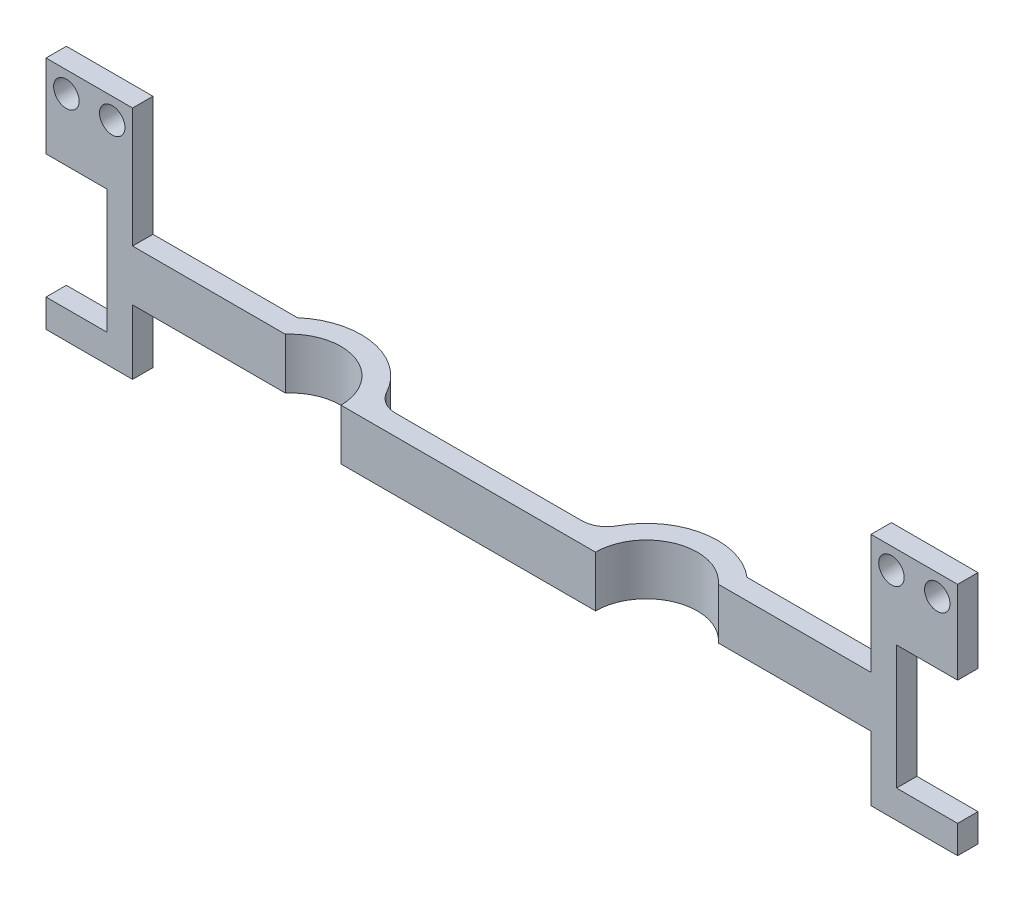
ISO-10303-21;
HEADER;
FILE_DESCRIPTION(('STEP AP214'),'2;1');
FILE_NAME('part.step','',(''),(''),'','','');
FILE_SCHEMA(('AUTOMOTIVE_DESIGN { 1 0 10303 214 1 1 1 1 }'));
ENDSEC;
DATA;
#1=APPLICATION_CONTEXT('core data for automotive mechanical design processes');
#2=APPLICATION_PROTOCOL_DEFINITION('international standard','automotive_design',2000,#1);
#3=PRODUCT_CONTEXT('',#1,'mechanical');
#4=PRODUCT('Part','Part','',(#3));
#5=PRODUCT_RELATED_PRODUCT_CATEGORY('part','',(#4));
#6=PRODUCT_DEFINITION_FORMATION('','',#4);
#7=PRODUCT_DEFINITION_CONTEXT('part definition',#1,'design');
#8=PRODUCT_DEFINITION('design','',#6,#7);
#9=PRODUCT_DEFINITION_SHAPE('','',#8);
#10=(LENGTH_UNIT() NAMED_UNIT(*) SI_UNIT(.MILLI.,.METRE.));
#11=(NAMED_UNIT(*) PLANE_ANGLE_UNIT() SI_UNIT($,.RADIAN.));
#12=(NAMED_UNIT(*) SI_UNIT($,.STERADIAN.) SOLID_ANGLE_UNIT());
#13=UNCERTAINTY_MEASURE_WITH_UNIT(LENGTH_MEASURE(1.E-05),#10,'distance_accuracy_value','');
#14=(GEOMETRIC_REPRESENTATION_CONTEXT(3) GLOBAL_UNCERTAINTY_ASSIGNED_CONTEXT((#13)) GLOBAL_UNIT_ASSIGNED_CONTEXT((#10,
#11,#12)) REPRESENTATION_CONTEXT('',''));
#15=CARTESIAN_POINT('',(0.,0.,0.));
#16=DIRECTION('',(0.,0.,1.));
#17=DIRECTION('',(1.,0.,0.));
#18=AXIS2_PLACEMENT_3D('',#15,#16,#17);
#19=CARTESIAN_POINT('',(-12.7,12.7,0.));
#20=DIRECTION('',(0.,-1.,0.));
#21=DIRECTION('',(0.,0.,-1.));
#22=AXIS2_PLACEMENT_3D('',#19,#20,#21);
#23=CYLINDRICAL_SURFACE('',#22,12.7);
#24=CARTESIAN_POINT('',(-12.7,0.,0.));
#25=DIRECTION('',(0.,-1.,0.));
#26=DIRECTION('',(0.,0.,-1.));
#27=AXIS2_PLACEMENT_3D('',#24,#25,#26);
#28=CIRCLE('',#27,12.7);
#29=CARTESIAN_POINT('',(-22.2410731052644,0.,-8.38200000000001));
#30=VERTEX_POINT('',#29);
#31=CARTESIAN_POINT('',(0.,0.,0.));
#32=VERTEX_POINT('',#31);
#33=EDGE_CURVE('E169',#30,#32,#28,.T.);
#34=ORIENTED_EDGE('',*,*,#33,.T.);
#35=DIRECTION('',(0.,-1.,0.));
#36=VECTOR('',#35,1.);
#37=CARTESIAN_POINT('',(0.,12.7,0.));
#38=LINE('',#37,#36);
#39=CARTESIAN_POINT('',(0.,12.7,0.));
#40=VERTEX_POINT('',#39);
#41=EDGE_CURVE('E11',#40,#32,#38,.T.);
#42=ORIENTED_EDGE('',*,*,#41,.F.);
#43=CARTESIAN_POINT('',(-12.7,12.7,0.));
#44=DIRECTION('',(0.,-1.,0.));
#45=DIRECTION('',(0.,0.,-1.));
#46=AXIS2_PLACEMENT_3D('',#43,#44,#45);
#47=CIRCLE('',#46,12.7);
#48=CARTESIAN_POINT('',(-22.2410731052644,12.7,-8.38200000000001));
#49=VERTEX_POINT('',#48);
#50=EDGE_CURVE('E214',#49,#40,#47,.T.);
#51=ORIENTED_EDGE('',*,*,#50,.F.);
#52=DIRECTION('',(0.,-1.,0.));
#53=VECTOR('',#52,1.);
#54=CARTESIAN_POINT('',(-22.2410731052644,12.7,-8.38200000000001));
#55=LINE('',#54,#53);
#56=EDGE_CURVE('E153',#49,#30,#55,.T.);
#57=ORIENTED_EDGE('',*,*,#56,.T.);
#58=EDGE_LOOP('',(#34,#42,#51,#57));
#59=FACE_BOUND('',#58,.T.);
#60=ADVANCED_FACE('F39',(#59),#23,.F.);
#61=CARTESIAN_POINT('',(0.,12.7,0.));
#62=DIRECTION('',(0.,0.,-1.));
#63=DIRECTION('',(-1.,0.,0.));
#64=AXIS2_PLACEMENT_3D('',#61,#62,#63);
#65=PLANE('',#64);
#66=DIRECTION('',(1.,0.,0.));
#67=VECTOR('',#66,1.);
#68=CARTESIAN_POINT('',(0.,0.,0.));
#69=LINE('',#68,#67);
#70=CARTESIAN_POINT('',(63.5,0.,0.));
#71=VERTEX_POINT('',#70);
#72=EDGE_CURVE('E173',#32,#71,#69,.T.);
#73=ORIENTED_EDGE('',*,*,#72,.T.);
#74=DIRECTION('',(0.,-1.,0.));
#75=VECTOR('',#74,1.);
#76=CARTESIAN_POINT('',(63.5,12.7,0.));
#77=LINE('',#76,#75);
#78=CARTESIAN_POINT('',(63.5,12.7,0.));
#79=VERTEX_POINT('',#78);
#80=EDGE_CURVE('E48',#79,#71,#77,.T.);
#81=ORIENTED_EDGE('',*,*,#80,.F.);
#82=DIRECTION('',(1.,0.,0.));
#83=VECTOR('',#82,1.);
#84=CARTESIAN_POINT('',(0.,12.7,0.));
#85=LINE('',#84,#83);
#86=EDGE_CURVE('E108',#40,#79,#85,.T.);
#87=ORIENTED_EDGE('',*,*,#86,.F.);
#88=ORIENTED_EDGE('',*,*,#41,.T.);
#89=EDGE_LOOP('',(#73,#81,#87,#88));
#90=FACE_BOUND('',#89,.T.);
#91=ADVANCED_FACE('F694',(#90),#65,.F.);
#92=CARTESIAN_POINT('',(76.2,12.7,0.));
#93=DIRECTION('',(0.,-1.,0.));
#94=DIRECTION('',(0.,0.,-1.));
#95=AXIS2_PLACEMENT_3D('',#92,#93,#94);
#96=CYLINDRICAL_SURFACE('',#95,12.7);
#97=CARTESIAN_POINT('',(76.2,0.,0.));
#98=DIRECTION('',(0.,-1.,0.));
#99=DIRECTION('',(0.,0.,1.));
#100=AXIS2_PLACEMENT_3D('',#97,#98,#99);
#101=CIRCLE('',#100,12.7);
#102=CARTESIAN_POINT('',(85.7410731052644,0.,-8.382));
#103=VERTEX_POINT('',#102);
#104=EDGE_CURVE('E177',#71,#103,#101,.T.);
#105=ORIENTED_EDGE('',*,*,#104,.T.);
#106=DIRECTION('',(0.,-1.,0.));
#107=VECTOR('',#106,1.);
#108=CARTESIAN_POINT('',(85.7410731052644,12.7,-8.382));
#109=LINE('',#108,#107);
#110=CARTESIAN_POINT('',(85.7410731052644,12.7,-8.382));
#111=VERTEX_POINT('',#110);
#112=EDGE_CURVE('E235',#111,#103,#109,.T.);
#113=ORIENTED_EDGE('',*,*,#112,.F.);
#114=CARTESIAN_POINT('',(76.2,12.7,0.));
#115=DIRECTION('',(0.,-1.,0.));
#116=DIRECTION('',(0.,0.,1.));
#117=AXIS2_PLACEMENT_3D('',#114,#115,#116);
#118=CIRCLE('',#117,12.7);
#119=EDGE_CURVE('E245',#79,#111,#118,.T.);
#120=ORIENTED_EDGE('',*,*,#119,.F.);
#121=ORIENTED_EDGE('',*,*,#80,.T.);
#122=EDGE_LOOP('',(#105,#113,#120,#121));
#123=FACE_BOUND('',#122,.T.);
#124=ADVANCED_FACE('F243',(#123),#96,.F.);
#125=CARTESIAN_POINT('',(123.841073105264,12.7,-8.38200000000001));
#126=DIRECTION('',(0.,0.,-1.));
#127=DIRECTION('',(-1.,0.,0.));
#128=AXIS2_PLACEMENT_3D('',#125,#126,#127);
#129=PLANE('',#128);
#130=CARTESIAN_POINT('',(140.351073105264,37.32276,-8.38200000000001));
#131=DIRECTION('',(0.,0.,-1.));
#132=DIRECTION('',(-1.,0.,0.));
#133=AXIS2_PLACEMENT_3D('',#130,#131,#132);
#134=CIRCLE('',#133,3.175);
#135=CARTESIAN_POINT('',(137.176073105264,37.32276,-8.38200000000001));
#136=VERTEX_POINT('',#135);
#137=EDGE_CURVE('E526',#136,#136,#134,.F.);
#138=ORIENTED_EDGE('',*,*,#137,.F.);
#139=EDGE_LOOP('',(#138));
#140=FACE_BOUND('',#139,.T.);
#141=CARTESIAN_POINT('',(128.921073105264,37.32276,-8.38200000000001));
#142=DIRECTION('',(0.,0.,-1.));
#143=DIRECTION('',(-1.,0.,0.));
#144=AXIS2_PLACEMENT_3D('',#141,#142,#143);
#145=CIRCLE('',#144,3.175);
#146=CARTESIAN_POINT('',(125.746073105264,37.32276,-8.38200000000001));
#147=VERTEX_POINT('',#146);
#148=EDGE_CURVE('E570',#147,#147,#145,.F.);
#149=ORIENTED_EDGE('',*,*,#148,.F.);
#150=EDGE_LOOP('',(#149));
#151=FACE_BOUND('',#150,.T.);
#152=DIRECTION('',(1.,0.,0.));
#153=VECTOR('',#152,1.);
#154=CARTESIAN_POINT('',(123.841073105264,0.,-8.38200000000001));
#155=LINE('',#154,#153);
#156=CARTESIAN_POINT('',(123.841073105264,0.,-8.38200000000001));
#157=VERTEX_POINT('',#156);
#158=EDGE_CURVE('E180',#103,#157,#155,.T.);
#159=ORIENTED_EDGE('',*,*,#158,.T.);
#160=DIRECTION('',(0.,-1.,0.));
#161=VECTOR('',#160,1.);
#162=CARTESIAN_POINT('',(123.841073105264,28.8036,-8.38200000000001));
#163=LINE('',#162,#161);
#164=CARTESIAN_POINT('',(123.841073105264,-16.1036,-8.38200000000001));
#165=VERTEX_POINT('',#164);
#166=EDGE_CURVE('E259',#157,#165,#163,.T.);
#167=ORIENTED_EDGE('',*,*,#166,.T.);
#168=DIRECTION('',(1.,0.,0.));
#169=VECTOR('',#168,1.);
#170=CARTESIAN_POINT('',(145.431073105264,-16.1036,-8.38200000000001));
#171=LINE('',#170,#169);
#172=CARTESIAN_POINT('',(145.431073105264,-16.1036,-8.38200000000001));
#173=VERTEX_POINT('',#172);
#174=EDGE_CURVE('E527',#165,#173,#171,.T.);
#175=ORIENTED_EDGE('',*,*,#174,.T.);
#176=DIRECTION('',(0.,1.,0.));
#177=VECTOR('',#176,1.);
#178=CARTESIAN_POINT('',(145.431073105264,-9.10590000000003,-8.38200000000001));
#179=LINE('',#178,#177);
#180=CARTESIAN_POINT('',(145.431073105264,-9.10590000000003,-8.38200000000001));
#181=VERTEX_POINT('',#180);
#182=EDGE_CURVE('E530',#173,#181,#179,.T.);
#183=ORIENTED_EDGE('',*,*,#182,.T.);
#184=DIRECTION('',(-1.,0.,0.));
#185=VECTOR('',#184,1.);
#186=CARTESIAN_POINT('',(130.191073105264,-9.10590000000002,-8.38200000000001));
#187=LINE('',#186,#185);
#188=CARTESIAN_POINT('',(130.191073105264,-9.10590000000002,-8.38200000000001));
#189=VERTEX_POINT('',#188);
#190=EDGE_CURVE('E534',#181,#189,#187,.T.);
#191=ORIENTED_EDGE('',*,*,#190,.T.);
#192=DIRECTION('',(0.,1.,0.));
#193=VECTOR('',#192,1.);
#194=CARTESIAN_POINT('',(130.191073105264,21.8059,-8.38200000000001));
#195=LINE('',#194,#193);
#196=CARTESIAN_POINT('',(130.191073105264,21.8059,-8.38200000000001));
#197=VERTEX_POINT('',#196);
#198=EDGE_CURVE('E538',#189,#197,#195,.T.);
#199=ORIENTED_EDGE('',*,*,#198,.T.);
#200=DIRECTION('',(1.,0.,0.));
#201=VECTOR('',#200,1.);
#202=CARTESIAN_POINT('',(145.431073105264,21.8059,-8.38200000000001));
#203=LINE('',#202,#201);
#204=CARTESIAN_POINT('',(145.431073105264,21.8059,-8.38200000000001));
#205=VERTEX_POINT('',#204);
#206=EDGE_CURVE('E542',#197,#205,#203,.T.);
#207=ORIENTED_EDGE('',*,*,#206,.T.);
#208=DIRECTION('',(0.,1.,0.));
#209=VECTOR('',#208,1.);
#210=CARTESIAN_POINT('',(145.431073105264,28.8036,-8.38200000000001));
#211=LINE('',#210,#209);
#212=CARTESIAN_POINT('',(145.431073105264,42.5196,-8.38200000000001));
#213=VERTEX_POINT('',#212);
#214=EDGE_CURVE('E546',#205,#213,#211,.T.);
#215=ORIENTED_EDGE('',*,*,#214,.T.);
#216=DIRECTION('',(-1.,0.,0.));
#217=VECTOR('',#216,1.);
#218=CARTESIAN_POINT('',(145.431073105264,42.5196,-8.38200000000001));
#219=LINE('',#218,#217);
#220=CARTESIAN_POINT('',(123.841073105264,42.5196,-8.38200000000001));
#221=VERTEX_POINT('',#220);
#222=EDGE_CURVE('E493',#213,#221,#219,.T.);
#223=ORIENTED_EDGE('',*,*,#222,.T.);
#224=CARTESIAN_POINT('',(123.841073105264,12.7,-8.38200000000001));
#225=VERTEX_POINT('',#224);
#226=EDGE_CURVE('E455',#221,#225,#163,.T.);
#227=ORIENTED_EDGE('',*,*,#226,.T.);
#228=DIRECTION('',(1.,0.,0.));
#229=VECTOR('',#228,1.);
#230=CARTESIAN_POINT('',(123.841073105264,12.7,-8.38200000000001));
#231=LINE('',#230,#229);
#232=EDGE_CURVE('E391',#111,#225,#231,.T.);
#233=ORIENTED_EDGE('',*,*,#232,.F.);
#234=ORIENTED_EDGE('',*,*,#112,.T.);
#235=EDGE_LOOP('',(#159,#167,#175,#183,#191,#199,#207,#215,#223,#227,#233,#234));
#236=FACE_BOUND('',#235,.T.);
#237=ADVANCED_FACE('F255',(#140,#151,#236),#129,.F.);
#238=CARTESIAN_POINT('',(123.841073105264,12.7,-13.462));
#239=DIRECTION('',(0.,0.,1.));
#240=DIRECTION('',(1.,0.,0.));
#241=AXIS2_PLACEMENT_3D('',#238,#239,#240);
#242=PLANE('',#241);
#243=CARTESIAN_POINT('',(140.351073105264,37.32276,-13.462));
#244=DIRECTION('',(0.,0.,-1.));
#245=DIRECTION('',(-1.,0.,0.));
#246=AXIS2_PLACEMENT_3D('',#243,#244,#245);
#247=CIRCLE('',#246,3.175);
#248=CARTESIAN_POINT('',(137.176073105264,37.32276,-13.462));
#249=VERTEX_POINT('',#248);
#250=EDGE_CURVE('E574',#249,#249,#247,.T.);
#251=ORIENTED_EDGE('',*,*,#250,.F.);
#252=EDGE_LOOP('',(#251));
#253=FACE_BOUND('',#252,.T.);
#254=CARTESIAN_POINT('',(128.921073105264,37.32276,-13.462));
#255=DIRECTION('',(0.,0.,-1.));
#256=DIRECTION('',(-1.,0.,0.));
#257=AXIS2_PLACEMENT_3D('',#254,#255,#256);
#258=CIRCLE('',#257,3.175);
#259=CARTESIAN_POINT('',(125.746073105264,37.32276,-13.462));
#260=VERTEX_POINT('',#259);
#261=EDGE_CURVE('E566',#260,#260,#258,.T.);
#262=ORIENTED_EDGE('',*,*,#261,.F.);
#263=EDGE_LOOP('',(#262));
#264=FACE_BOUND('',#263,.T.);
#265=DIRECTION('',(-1.,0.,0.));
#266=VECTOR('',#265,1.);
#267=CARTESIAN_POINT('',(123.841073105264,0.,-13.462));
#268=LINE('',#267,#266);
#269=CARTESIAN_POINT('',(123.841073105264,0.,-13.462));
#270=VERTEX_POINT('',#269);
#271=CARTESIAN_POINT('',(87.8147731790165,0.,-13.462));
#272=VERTEX_POINT('',#271);
#273=EDGE_CURVE('E188',#270,#272,#268,.T.);
#274=ORIENTED_EDGE('',*,*,#273,.T.);
#275=DIRECTION('',(0.,-1.,0.));
#276=VECTOR('',#275,1.);
#277=CARTESIAN_POINT('',(87.8147731790165,12.7,-13.462));
#278=LINE('',#277,#276);
#279=CARTESIAN_POINT('',(87.8147731790165,12.7,-13.462));
#280=VERTEX_POINT('',#279);
#281=EDGE_CURVE('E231',#280,#272,#278,.T.);
#282=ORIENTED_EDGE('',*,*,#281,.F.);
#283=DIRECTION('',(-1.,0.,0.));
#284=VECTOR('',#283,1.);
#285=CARTESIAN_POINT('',(123.841073105264,12.7,-13.462));
#286=LINE('',#285,#284);
#287=CARTESIAN_POINT('',(123.841073105264,12.7,-13.462));
#288=VERTEX_POINT('',#287);
#289=EDGE_CURVE('E399',#288,#280,#286,.T.);
#290=ORIENTED_EDGE('',*,*,#289,.F.);
#291=DIRECTION('',(0.,1.,0.));
#292=VECTOR('',#291,1.);
#293=CARTESIAN_POINT('',(123.841073105264,28.8036,-13.462));
#294=LINE('',#293,#292);
#295=CARTESIAN_POINT('',(123.841073105264,42.5196,-13.462));
#296=VERTEX_POINT('',#295);
#297=EDGE_CURVE('E521',#288,#296,#294,.T.);
#298=ORIENTED_EDGE('',*,*,#297,.T.);
#299=DIRECTION('',(1.,0.,0.));
#300=VECTOR('',#299,1.);
#301=CARTESIAN_POINT('',(145.431073105264,42.5196,-13.462));
#302=LINE('',#301,#300);
#303=CARTESIAN_POINT('',(145.431073105264,42.5196,-13.462));
#304=VERTEX_POINT('',#303);
#305=EDGE_CURVE('E513',#296,#304,#302,.T.);
#306=ORIENTED_EDGE('',*,*,#305,.T.);
#307=DIRECTION('',(0.,-1.,0.));
#308=VECTOR('',#307,1.);
#309=CARTESIAN_POINT('',(145.431073105264,28.8036,-13.462));
#310=LINE('',#309,#308);
#311=CARTESIAN_POINT('',(145.431073105264,21.8059,-13.462));
#312=VERTEX_POINT('',#311);
#313=EDGE_CURVE('E509',#304,#312,#310,.T.);
#314=ORIENTED_EDGE('',*,*,#313,.T.);
#315=DIRECTION('',(-1.,0.,0.));
#316=VECTOR('',#315,1.);
#317=CARTESIAN_POINT('',(145.431073105264,21.8059,-13.462));
#318=LINE('',#317,#316);
#319=CARTESIAN_POINT('',(130.191073105264,21.8059,-13.462));
#320=VERTEX_POINT('',#319);
#321=EDGE_CURVE('E505',#312,#320,#318,.T.);
#322=ORIENTED_EDGE('',*,*,#321,.T.);
#323=DIRECTION('',(0.,-1.,0.));
#324=VECTOR('',#323,1.);
#325=CARTESIAN_POINT('',(130.191073105264,21.8059,-13.462));
#326=LINE('',#325,#324);
#327=CARTESIAN_POINT('',(130.191073105264,-9.10590000000002,-13.462));
#328=VERTEX_POINT('',#327);
#329=EDGE_CURVE('E501',#320,#328,#326,.T.);
#330=ORIENTED_EDGE('',*,*,#329,.T.);
#331=DIRECTION('',(1.,0.,0.));
#332=VECTOR('',#331,1.);
#333=CARTESIAN_POINT('',(130.191073105264,-9.10590000000002,-13.462));
#334=LINE('',#333,#332);
#335=CARTESIAN_POINT('',(145.431073105264,-9.10590000000003,-13.462));
#336=VERTEX_POINT('',#335);
#337=EDGE_CURVE('E497',#328,#336,#334,.T.);
#338=ORIENTED_EDGE('',*,*,#337,.T.);
#339=DIRECTION('',(0.,-1.,0.));
#340=VECTOR('',#339,1.);
#341=CARTESIAN_POINT('',(145.431073105264,-9.10590000000003,-13.462));
#342=LINE('',#341,#340);
#343=CARTESIAN_POINT('',(145.431073105264,-16.1036,-13.462));
#344=VERTEX_POINT('',#343);
#345=EDGE_CURVE('E465',#336,#344,#342,.T.);
#346=ORIENTED_EDGE('',*,*,#345,.T.);
#347=DIRECTION('',(-1.,0.,0.));
#348=VECTOR('',#347,1.);
#349=CARTESIAN_POINT('',(145.431073105264,-16.1036,-13.462));
#350=LINE('',#349,#348);
#351=CARTESIAN_POINT('',(123.841073105264,-16.1036,-13.462));
#352=VERTEX_POINT('',#351);
#353=EDGE_CURVE('E522',#344,#352,#350,.T.);
#354=ORIENTED_EDGE('',*,*,#353,.T.);
#355=EDGE_CURVE('E517',#352,#270,#294,.T.);
#356=ORIENTED_EDGE('',*,*,#355,.T.);
#357=EDGE_LOOP('',(#274,#282,#290,#298,#306,#314,#322,#330,#338,#346,#354,#356));
#358=FACE_BOUND('',#357,.T.);
#359=ADVANCED_FACE('F587',(#253,#264,#358),#242,.F.);
#360=CARTESIAN_POINT('',(76.2,12.7,0.));
#361=DIRECTION('',(0.,-1.,0.));
#362=DIRECTION('',(0.,0.,-1.));
#363=AXIS2_PLACEMENT_3D('',#360,#361,#362);
#364=CYLINDRICAL_SURFACE('',#363,17.78);
#365=CARTESIAN_POINT('',(76.2,0.,0.));
#366=DIRECTION('',(0.,1.,0.));
#367=DIRECTION('',(0.,0.,1.));
#368=AXIS2_PLACEMENT_3D('',#365,#366,#367);
#369=CIRCLE('',#368,17.78);
#370=CARTESIAN_POINT('',(60.5412470823412,0.,-8.4221052631579));
#371=VERTEX_POINT('',#370);
#372=EDGE_CURVE('E191',#272,#371,#369,.T.);
#373=ORIENTED_EDGE('',*,*,#372,.T.);
#374=DIRECTION('',(0.,-1.,0.));
#375=VECTOR('',#374,1.);
#376=CARTESIAN_POINT('',(60.5412470823412,12.7,-8.4221052631579));
#377=LINE('',#376,#375);
#378=CARTESIAN_POINT('',(60.5412470823412,12.7,-8.4221052631579));
#379=VERTEX_POINT('',#378);
#380=EDGE_CURVE('E227',#379,#371,#377,.T.);
#381=ORIENTED_EDGE('',*,*,#380,.F.);
#382=CARTESIAN_POINT('',(76.2,12.7,0.));
#383=DIRECTION('',(0.,1.,0.));
#384=DIRECTION('',(0.,0.,1.));
#385=AXIS2_PLACEMENT_3D('',#382,#383,#384);
#386=CIRCLE('',#385,17.78);
#387=EDGE_CURVE('E402',#280,#379,#386,.T.);
#388=ORIENTED_EDGE('',*,*,#387,.F.);
#389=ORIENTED_EDGE('',*,*,#281,.T.);
#390=EDGE_LOOP('',(#373,#381,#388,#389));
#391=FACE_BOUND('',#390,.T.);
#392=ADVANCED_FACE('F590',(#391),#364,.T.);
#393=CARTESIAN_POINT('',(54.9488353260345,12.7,-11.43));
#394=DIRECTION('',(0.,-1.,0.));
#395=DIRECTION('',(0.,0.,-1.));
#396=AXIS2_PLACEMENT_3D('',#393,#394,#395);
#397=CYLINDRICAL_SURFACE('',#396,6.35);
#398=CARTESIAN_POINT('',(54.9488353260345,0.,-11.43));
#399=DIRECTION('',(0.,-1.,0.));
#400=DIRECTION('',(0.,0.,1.));
#401=AXIS2_PLACEMENT_3D('',#398,#399,#400);
#402=CIRCLE('',#401,6.35);
#403=CARTESIAN_POINT('',(54.9488353260345,0.,-5.08));
#404=VERTEX_POINT('',#403);
#405=EDGE_CURVE('E194',#371,#404,#402,.T.);
#406=ORIENTED_EDGE('',*,*,#405,.T.);
#407=DIRECTION('',(0.,-1.,0.));
#408=VECTOR('',#407,1.);
#409=CARTESIAN_POINT('',(54.9488353260345,12.7,-5.08));
#410=LINE('',#409,#408);
#411=CARTESIAN_POINT('',(54.9488353260345,12.7,-5.08));
#412=VERTEX_POINT('',#411);
#413=EDGE_CURVE('E223',#412,#404,#410,.T.);
#414=ORIENTED_EDGE('',*,*,#413,.F.);
#415=CARTESIAN_POINT('',(54.9488353260345,12.7,-11.43));
#416=DIRECTION('',(0.,-1.,0.));
#417=DIRECTION('',(0.,0.,1.));
#418=AXIS2_PLACEMENT_3D('',#415,#416,#417);
#419=CIRCLE('',#418,6.35);
#420=EDGE_CURVE('E405',#379,#412,#419,.T.);
#421=ORIENTED_EDGE('',*,*,#420,.F.);
#422=ORIENTED_EDGE('',*,*,#380,.T.);
#423=EDGE_LOOP('',(#406,#414,#421,#422));
#424=FACE_BOUND('',#423,.T.);
#425=ADVANCED_FACE('F606',(#424),#397,.F.);
#426=CARTESIAN_POINT('',(8.55116467396553,12.7,-5.08));
#427=DIRECTION('',(0.,0.,1.));
#428=DIRECTION('',(1.,0.,0.));
#429=AXIS2_PLACEMENT_3D('',#426,#427,#428);
#430=PLANE('',#429);
#431=DIRECTION('',(-1.,0.,0.));
#432=VECTOR('',#431,1.);
#433=CARTESIAN_POINT('',(8.55116467396553,0.,-5.08));
#434=LINE('',#433,#432);
#435=CARTESIAN_POINT('',(8.55116467396553,0.,-5.08));
#436=VERTEX_POINT('',#435);
#437=EDGE_CURVE('E197',#404,#436,#434,.T.);
#438=ORIENTED_EDGE('',*,*,#437,.T.);
#439=DIRECTION('',(0.,-1.,0.));
#440=VECTOR('',#439,1.);
#441=CARTESIAN_POINT('',(8.55116467396553,12.7,-5.08));
#442=LINE('',#441,#440);
#443=CARTESIAN_POINT('',(8.55116467396553,12.7,-5.08));
#444=VERTEX_POINT('',#443);
#445=EDGE_CURVE('E219',#444,#436,#442,.T.);
#446=ORIENTED_EDGE('',*,*,#445,.F.);
#447=DIRECTION('',(-1.,0.,0.));
#448=VECTOR('',#447,1.);
#449=CARTESIAN_POINT('',(8.55116467396553,12.7,-5.08));
#450=LINE('',#449,#448);
#451=EDGE_CURVE('E408',#412,#444,#450,.T.);
#452=ORIENTED_EDGE('',*,*,#451,.F.);
#453=ORIENTED_EDGE('',*,*,#413,.T.);
#454=EDGE_LOOP('',(#438,#446,#452,#453));
#455=FACE_BOUND('',#454,.T.);
#456=ADVANCED_FACE('F610',(#455),#430,.F.);
#457=CARTESIAN_POINT('',(8.55116467396553,12.7,-11.43));
#458=DIRECTION('',(0.,-1.,0.));
#459=DIRECTION('',(0.,0.,-1.));
#460=AXIS2_PLACEMENT_3D('',#457,#458,#459);
#461=CYLINDRICAL_SURFACE('',#460,6.35000000000001);
#462=CARTESIAN_POINT('',(8.55116467396553,0.,-11.43));
#463=DIRECTION('',(0.,-1.,0.));
#464=DIRECTION('',(0.,0.,-1.));
#465=AXIS2_PLACEMENT_3D('',#462,#463,#464);
#466=CIRCLE('',#465,6.35000000000001);
#467=CARTESIAN_POINT('',(2.95875291765881,0.,-8.4221052631579));
#468=VERTEX_POINT('',#467);
#469=EDGE_CURVE('E200',#436,#468,#466,.T.);
#470=ORIENTED_EDGE('',*,*,#469,.T.);
#471=DIRECTION('',(0.,-1.,0.));
#472=VECTOR('',#471,1.);
#473=CARTESIAN_POINT('',(2.95875291765881,12.7,-8.4221052631579));
#474=LINE('',#473,#472);
#475=CARTESIAN_POINT('',(2.95875291765881,12.7,-8.4221052631579));
#476=VERTEX_POINT('',#475);
#477=EDGE_CURVE('E152',#476,#468,#474,.T.);
#478=ORIENTED_EDGE('',*,*,#477,.F.);
#479=CARTESIAN_POINT('',(8.55116467396553,12.7,-11.43));
#480=DIRECTION('',(0.,-1.,0.));
#481=DIRECTION('',(0.,0.,-1.));
#482=AXIS2_PLACEMENT_3D('',#479,#480,#481);
#483=CIRCLE('',#482,6.35000000000001);
#484=EDGE_CURVE('E142',#444,#476,#483,.T.);
#485=ORIENTED_EDGE('',*,*,#484,.F.);
#486=ORIENTED_EDGE('',*,*,#445,.T.);
#487=EDGE_LOOP('',(#470,#478,#485,#486));
#488=FACE_BOUND('',#487,.T.);
#489=ADVANCED_FACE('F712',(#488),#461,.F.);
#490=CARTESIAN_POINT('',(-12.7,12.7,0.));
#491=DIRECTION('',(0.,-1.,0.));
#492=DIRECTION('',(0.,0.,-1.));
#493=AXIS2_PLACEMENT_3D('',#490,#491,#492);
#494=CYLINDRICAL_SURFACE('',#493,17.78);
#495=CARTESIAN_POINT('',(-12.7,0.,0.));
#496=DIRECTION('',(0.,1.,0.));
#497=DIRECTION('',(0.,0.,-1.));
#498=AXIS2_PLACEMENT_3D('',#495,#496,#497);
#499=CIRCLE('',#498,17.78);
#500=CARTESIAN_POINT('',(-24.3147731790165,0.,-13.462));
#501=VERTEX_POINT('',#500);
#502=EDGE_CURVE('E93',#468,#501,#499,.T.);
#503=ORIENTED_EDGE('',*,*,#502,.T.);
#504=DIRECTION('',(0.,-1.,0.));
#505=VECTOR('',#504,1.);
#506=CARTESIAN_POINT('',(-24.3147731790165,12.7,-13.462));
#507=LINE('',#506,#505);
#508=CARTESIAN_POINT('',(-24.3147731790165,12.7,-13.462));
#509=VERTEX_POINT('',#508);
#510=EDGE_CURVE('E146',#509,#501,#507,.T.);
#511=ORIENTED_EDGE('',*,*,#510,.F.);
#512=CARTESIAN_POINT('',(-12.7,12.7,0.));
#513=DIRECTION('',(0.,1.,0.));
#514=DIRECTION('',(0.,0.,-1.));
#515=AXIS2_PLACEMENT_3D('',#512,#513,#514);
#516=CIRCLE('',#515,17.78);
#517=EDGE_CURVE('E136',#476,#509,#516,.T.);
#518=ORIENTED_EDGE('',*,*,#517,.F.);
#519=ORIENTED_EDGE('',*,*,#477,.T.);
#520=EDGE_LOOP('',(#503,#511,#518,#519));
#521=FACE_BOUND('',#520,.T.);
#522=ADVANCED_FACE('F147',(#521),#494,.T.);
#523=CARTESIAN_POINT('',(-60.3410731052644,12.7,-13.462));
#524=DIRECTION('',(0.,0.,1.));
#525=DIRECTION('',(1.,0.,0.));
#526=AXIS2_PLACEMENT_3D('',#523,#524,#525);
#527=PLANE('',#526);
#528=CARTESIAN_POINT('',(-65.4210731052644,37.32276,-13.462));
#529=DIRECTION('',(0.,0.,-1.));
#530=DIRECTION('',(-1.,0.,0.));
#531=AXIS2_PLACEMENT_3D('',#528,#529,#530);
#532=CIRCLE('',#531,3.175);
#533=CARTESIAN_POINT('',(-68.5960731052644,37.32276,-13.462));
#534=VERTEX_POINT('',#533);
#535=EDGE_CURVE('E557',#534,#534,#532,.T.);
#536=ORIENTED_EDGE('',*,*,#535,.F.);
#537=EDGE_LOOP('',(#536));
#538=FACE_BOUND('',#537,.T.);
#539=CARTESIAN_POINT('',(-76.8510731052644,37.32276,-13.4619999999999));
#540=DIRECTION('',(0.,0.,-1.));
#541=DIRECTION('',(-1.,0.,0.));
#542=AXIS2_PLACEMENT_3D('',#539,#540,#541);
#543=CIRCLE('',#542,3.175);
#544=CARTESIAN_POINT('',(-80.0260731052644,37.32276,-13.4619999999999));
#545=VERTEX_POINT('',#544);
#546=EDGE_CURVE('E558',#545,#545,#543,.T.);
#547=ORIENTED_EDGE('',*,*,#546,.F.);
#548=EDGE_LOOP('',(#547));
#549=FACE_BOUND('',#548,.T.);
#550=DIRECTION('',(-1.,0.,0.));
#551=VECTOR('',#550,1.);
#552=CARTESIAN_POINT('',(-60.3410731052644,0.,-13.462));
#553=LINE('',#552,#551);
#554=CARTESIAN_POINT('',(-60.3410731052644,0.,-13.462));
#555=VERTEX_POINT('',#554);
#556=EDGE_CURVE('E205',#501,#555,#553,.T.);
#557=ORIENTED_EDGE('',*,*,#556,.T.);
#558=DIRECTION('',(0.,-1.,0.));
#559=VECTOR('',#558,1.);
#560=CARTESIAN_POINT('',(-60.3410731052644,-16.1036,-13.462));
#561=LINE('',#560,#559);
#562=CARTESIAN_POINT('',(-60.3410731052644,-16.1036,-13.462));
#563=VERTEX_POINT('',#562);
#564=EDGE_CURVE('E327',#555,#563,#561,.T.);
#565=ORIENTED_EDGE('',*,*,#564,.T.);
#566=DIRECTION('',(-1.,0.,0.));
#567=VECTOR('',#566,1.);
#568=CARTESIAN_POINT('',(-81.9310731052644,-16.1036,-13.462));
#569=LINE('',#568,#567);
#570=CARTESIAN_POINT('',(-81.9310731052644,-16.1036,-13.462));
#571=VERTEX_POINT('',#570);
#572=EDGE_CURVE('E381',#563,#571,#569,.T.);
#573=ORIENTED_EDGE('',*,*,#572,.T.);
#574=DIRECTION('',(0.,1.,0.));
#575=VECTOR('',#574,1.);
#576=CARTESIAN_POINT('',(-81.9310731052644,-9.1059,-13.462));
#577=LINE('',#576,#575);
#578=CARTESIAN_POINT('',(-81.9310731052644,-9.1059,-13.462));
#579=VERTEX_POINT('',#578);
#580=EDGE_CURVE('E452',#571,#579,#577,.T.);
#581=ORIENTED_EDGE('',*,*,#580,.T.);
#582=DIRECTION('',(1.,0.,0.));
#583=VECTOR('',#582,1.);
#584=CARTESIAN_POINT('',(-66.6910731052644,-9.1059,-13.462));
#585=LINE('',#584,#583);
#586=CARTESIAN_POINT('',(-66.6910731052644,-9.1059,-13.462));
#587=VERTEX_POINT('',#586);
#588=EDGE_CURVE('E448',#579,#587,#585,.T.);
#589=ORIENTED_EDGE('',*,*,#588,.T.);
#590=DIRECTION('',(0.,1.,0.));
#591=VECTOR('',#590,1.);
#592=CARTESIAN_POINT('',(-66.6910731052644,21.8059,-13.462));
#593=LINE('',#592,#591);
#594=CARTESIAN_POINT('',(-66.6910731052644,21.8059,-13.462));
#595=VERTEX_POINT('',#594);
#596=EDGE_CURVE('E444',#587,#595,#593,.T.);
#597=ORIENTED_EDGE('',*,*,#596,.T.);
#598=DIRECTION('',(-1.,0.,0.));
#599=VECTOR('',#598,1.);
#600=CARTESIAN_POINT('',(-81.9310731052644,21.8059,-13.462));
#601=LINE('',#600,#599);
#602=CARTESIAN_POINT('',(-81.9310731052644,21.8059,-13.462));
#603=VERTEX_POINT('',#602);
#604=EDGE_CURVE('E440',#595,#603,#601,.T.);
#605=ORIENTED_EDGE('',*,*,#604,.T.);
#606=DIRECTION('',(0.,1.,0.));
#607=VECTOR('',#606,1.);
#608=CARTESIAN_POINT('',(-81.9310731052644,28.8036,-13.462));
#609=LINE('',#608,#607);
#610=CARTESIAN_POINT('',(-81.9310731052644,42.5196,-13.462));
#611=VERTEX_POINT('',#610);
#612=EDGE_CURVE('E436',#603,#611,#609,.T.);
#613=ORIENTED_EDGE('',*,*,#612,.T.);
#614=DIRECTION('',(1.,0.,0.));
#615=VECTOR('',#614,1.);
#616=CARTESIAN_POINT('',(-60.3410731052644,42.5196,-13.462));
#617=LINE('',#616,#615);
#618=CARTESIAN_POINT('',(-60.3410731052644,42.5196,-13.462));
#619=VERTEX_POINT('',#618);
#620=EDGE_CURVE('E336',#611,#619,#617,.T.);
#621=ORIENTED_EDGE('',*,*,#620,.T.);
#622=CARTESIAN_POINT('',(-60.3410731052644,12.7,-13.462));
#623=VERTEX_POINT('',#622);
#624=EDGE_CURVE('E159',#619,#623,#561,.T.);
#625=ORIENTED_EDGE('',*,*,#624,.T.);
#626=DIRECTION('',(-1.,0.,0.));
#627=VECTOR('',#626,1.);
#628=CARTESIAN_POINT('',(-60.3410731052644,12.7,-13.462));
#629=LINE('',#628,#627);
#630=EDGE_CURVE('E140',#509,#623,#629,.T.);
#631=ORIENTED_EDGE('',*,*,#630,.F.);
#632=ORIENTED_EDGE('',*,*,#510,.T.);
#633=EDGE_LOOP('',(#557,#565,#573,#581,#589,#597,#605,#613,#621,#625,#631,#632));
#634=FACE_BOUND('',#633,.T.);
#635=ADVANCED_FACE('F156',(#538,#549,#634),#527,.F.);
#636=CARTESIAN_POINT('',(-60.3410731052644,12.7,-8.38200000000001));
#637=DIRECTION('',(0.,0.,-1.));
#638=DIRECTION('',(-1.,0.,0.));
#639=AXIS2_PLACEMENT_3D('',#636,#637,#638);
#640=PLANE('',#639);
#641=CARTESIAN_POINT('',(-65.4210731052644,37.32276,-8.38199999999998));
#642=DIRECTION('',(0.,0.,-1.));
#643=DIRECTION('',(-1.,0.,0.));
#644=AXIS2_PLACEMENT_3D('',#641,#642,#643);
#645=CIRCLE('',#644,3.175);
#646=CARTESIAN_POINT('',(-68.5960731052644,37.32276,-8.38199999999998));
#647=VERTEX_POINT('',#646);
#648=EDGE_CURVE('E562',#647,#647,#645,.F.);
#649=ORIENTED_EDGE('',*,*,#648,.F.);
#650=EDGE_LOOP('',(#649));
#651=FACE_BOUND('',#650,.T.);
#652=CARTESIAN_POINT('',(-76.8510731052644,37.32276,-8.38199999999998));
#653=DIRECTION('',(0.,0.,-1.));
#654=DIRECTION('',(-1.,0.,0.));
#655=AXIS2_PLACEMENT_3D('',#652,#653,#654);
#656=CIRCLE('',#655,3.175);
#657=CARTESIAN_POINT('',(-80.0260731052644,37.32276,-8.38199999999998));
#658=VERTEX_POINT('',#657);
#659=EDGE_CURVE('E553',#658,#658,#656,.F.);
#660=ORIENTED_EDGE('',*,*,#659,.F.);
#661=EDGE_LOOP('',(#660));
#662=FACE_BOUND('',#661,.T.);
#663=DIRECTION('',(1.,0.,0.));
#664=VECTOR('',#663,1.);
#665=CARTESIAN_POINT('',(-60.3410731052644,0.,-8.38200000000001));
#666=LINE('',#665,#664);
#667=CARTESIAN_POINT('',(-60.3410731052644,0.,-8.38200000000001));
#668=VERTEX_POINT('',#667);
#669=EDGE_CURVE('E100',#668,#30,#666,.T.);
#670=ORIENTED_EDGE('',*,*,#669,.T.);
#671=ORIENTED_EDGE('',*,*,#56,.F.);
#672=DIRECTION('',(1.,0.,0.));
#673=VECTOR('',#672,1.);
#674=CARTESIAN_POINT('',(-60.3410731052644,12.7,-8.38200000000001));
#675=LINE('',#674,#673);
#676=CARTESIAN_POINT('',(-60.3410731052644,12.7,-8.38200000000001));
#677=VERTEX_POINT('',#676);
#678=EDGE_CURVE('E56',#677,#49,#675,.T.);
#679=ORIENTED_EDGE('',*,*,#678,.F.);
#680=DIRECTION('',(0.,1.,0.));
#681=VECTOR('',#680,1.);
#682=CARTESIAN_POINT('',(-60.3410731052644,-16.1036,-8.38200000000001));
#683=LINE('',#682,#681);
#684=CARTESIAN_POINT('',(-60.3410731052644,42.5196,-8.38200000000001));
#685=VERTEX_POINT('',#684);
#686=EDGE_CURVE('E342',#677,#685,#683,.T.);
#687=ORIENTED_EDGE('',*,*,#686,.T.);
#688=DIRECTION('',(-1.,0.,0.));
#689=VECTOR('',#688,1.);
#690=CARTESIAN_POINT('',(-60.3410731052644,42.5196,-8.38200000000001));
#691=LINE('',#690,#689);
#692=CARTESIAN_POINT('',(-81.9310731052644,42.5196,-8.38200000000001));
#693=VERTEX_POINT('',#692);
#694=EDGE_CURVE('E344',#685,#693,#691,.T.);
#695=ORIENTED_EDGE('',*,*,#694,.T.);
#696=DIRECTION('',(0.,-1.,0.));
#697=VECTOR('',#696,1.);
#698=CARTESIAN_POINT('',(-81.9310731052644,28.8036,-8.38200000000001));
#699=LINE('',#698,#697);
#700=CARTESIAN_POINT('',(-81.9310731052644,21.8059,-8.38200000000001));
#701=VERTEX_POINT('',#700);
#702=EDGE_CURVE('E357',#693,#701,#699,.T.);
#703=ORIENTED_EDGE('',*,*,#702,.T.);
#704=DIRECTION('',(1.,0.,0.));
#705=VECTOR('',#704,1.);
#706=CARTESIAN_POINT('',(-81.9310731052644,21.8059,-8.38200000000001));
#707=LINE('',#706,#705);
#708=CARTESIAN_POINT('',(-66.6910731052644,21.8059,-8.38200000000001));
#709=VERTEX_POINT('',#708);
#710=EDGE_CURVE('E419',#701,#709,#707,.T.);
#711=ORIENTED_EDGE('',*,*,#710,.T.);
#712=DIRECTION('',(0.,-1.,0.));
#713=VECTOR('',#712,1.);
#714=CARTESIAN_POINT('',(-66.6910731052644,21.8059,-8.38200000000001));
#715=LINE('',#714,#713);
#716=CARTESIAN_POINT('',(-66.6910731052644,-9.1059,-8.38200000000001));
#717=VERTEX_POINT('',#716);
#718=EDGE_CURVE('E422',#709,#717,#715,.T.);
#719=ORIENTED_EDGE('',*,*,#718,.T.);
#720=DIRECTION('',(-1.,0.,0.));
#721=VECTOR('',#720,1.);
#722=CARTESIAN_POINT('',(-66.6910731052644,-9.1059,-8.38200000000001));
#723=LINE('',#722,#721);
#724=CARTESIAN_POINT('',(-81.9310731052644,-9.1059,-8.38200000000001));
#725=VERTEX_POINT('',#724);
#726=EDGE_CURVE('E174',#717,#725,#723,.T.);
#727=ORIENTED_EDGE('',*,*,#726,.T.);
#728=DIRECTION('',(0.,-1.,0.));
#729=VECTOR('',#728,1.);
#730=CARTESIAN_POINT('',(-81.9310731052644,-9.1059,-8.38200000000001));
#731=LINE('',#730,#729);
#732=CARTESIAN_POINT('',(-81.9310731052644,-16.1036,-8.38200000000001));
#733=VERTEX_POINT('',#732);
#734=EDGE_CURVE('E384',#725,#733,#731,.T.);
#735=ORIENTED_EDGE('',*,*,#734,.T.);
#736=DIRECTION('',(1.,0.,0.));
#737=VECTOR('',#736,1.);
#738=CARTESIAN_POINT('',(-81.9310731052644,-16.1036,-8.38200000000001));
#739=LINE('',#738,#737);
#740=CARTESIAN_POINT('',(-60.3410731052644,-16.1036,-8.38200000000001));
#741=VERTEX_POINT('',#740);
#742=EDGE_CURVE('E413',#733,#741,#739,.T.);
#743=ORIENTED_EDGE('',*,*,#742,.T.);
#744=EDGE_CURVE('E348',#741,#668,#683,.T.);
#745=ORIENTED_EDGE('',*,*,#744,.T.);
#746=EDGE_LOOP('',(#670,#671,#679,#687,#695,#703,#711,#719,#727,#735,#743,#745));
#747=FACE_BOUND('',#746,.T.);
#748=ADVANCED_FACE('F341',(#651,#662,#747),#640,.F.);
#749=CARTESIAN_POINT('',(-12.7,12.7,0.));
#750=DIRECTION('',(0.,-1.,0.));
#751=DIRECTION('',(0.,0.,-1.));
#752=AXIS2_PLACEMENT_3D('',#749,#750,#751);
#753=PLANE('',#752);
#754=ORIENTED_EDGE('',*,*,#50,.T.);
#755=ORIENTED_EDGE('',*,*,#86,.T.);
#756=ORIENTED_EDGE('',*,*,#119,.T.);
#757=ORIENTED_EDGE('',*,*,#232,.T.);
#758=DIRECTION('',(0.,0.,-1.));
#759=VECTOR('',#758,1.);
#760=CARTESIAN_POINT('',(123.841073105264,12.7,-13.462));
#761=LINE('',#760,#759);
#762=EDGE_CURVE('E395',#225,#288,#761,.T.);
#763=ORIENTED_EDGE('',*,*,#762,.T.);
#764=ORIENTED_EDGE('',*,*,#289,.T.);
#765=ORIENTED_EDGE('',*,*,#387,.T.);
#766=ORIENTED_EDGE('',*,*,#420,.T.);
#767=ORIENTED_EDGE('',*,*,#451,.T.);
#768=ORIENTED_EDGE('',*,*,#484,.T.);
#769=ORIENTED_EDGE('',*,*,#517,.T.);
#770=ORIENTED_EDGE('',*,*,#630,.T.);
#771=DIRECTION('',(0.,0.,1.));
#772=VECTOR('',#771,1.);
#773=CARTESIAN_POINT('',(-60.3410731052644,12.7,-13.462));
#774=LINE('',#773,#772);
#775=EDGE_CURVE('E161',#623,#677,#774,.T.);
#776=ORIENTED_EDGE('',*,*,#775,.T.);
#777=ORIENTED_EDGE('',*,*,#678,.T.);
#778=EDGE_LOOP('',(#754,#755,#756,#757,#763,#764,#765,#766,#767,#768,#769,#770,#776,#777));
#779=FACE_BOUND('',#778,.T.);
#780=ADVANCED_FACE('F137',(#779),#753,.F.);
#781=CARTESIAN_POINT('',(-12.7,0.,0.));
#782=DIRECTION('',(0.,-1.,0.));
#783=DIRECTION('',(0.,0.,-1.));
#784=AXIS2_PLACEMENT_3D('',#781,#782,#783);
#785=PLANE('',#784);
#786=ORIENTED_EDGE('',*,*,#33,.F.);
#787=ORIENTED_EDGE('',*,*,#669,.F.);
#788=DIRECTION('',(0.,0.,1.));
#789=VECTOR('',#788,1.);
#790=CARTESIAN_POINT('',(-60.3410731052644,0.,-13.462));
#791=LINE('',#790,#789);
#792=EDGE_CURVE('E208',#555,#668,#791,.T.);
#793=ORIENTED_EDGE('',*,*,#792,.F.);
#794=ORIENTED_EDGE('',*,*,#556,.F.);
#795=ORIENTED_EDGE('',*,*,#502,.F.);
#796=ORIENTED_EDGE('',*,*,#469,.F.);
#797=ORIENTED_EDGE('',*,*,#437,.F.);
#798=ORIENTED_EDGE('',*,*,#405,.F.);
#799=ORIENTED_EDGE('',*,*,#372,.F.);
#800=ORIENTED_EDGE('',*,*,#273,.F.);
#801=DIRECTION('',(0.,0.,-1.));
#802=VECTOR('',#801,1.);
#803=CARTESIAN_POINT('',(123.841073105264,0.,-13.462));
#804=LINE('',#803,#802);
#805=EDGE_CURVE('E184',#157,#270,#804,.T.);
#806=ORIENTED_EDGE('',*,*,#805,.F.);
#807=ORIENTED_EDGE('',*,*,#158,.F.);
#808=ORIENTED_EDGE('',*,*,#104,.F.);
#809=ORIENTED_EDGE('',*,*,#72,.F.);
#810=EDGE_LOOP('',(#786,#787,#793,#794,#795,#796,#797,#798,#799,#800,#806,#807,#808,#809));
#811=FACE_BOUND('',#810,.T.);
#812=ADVANCED_FACE('F249',(#811),#785,.T.);
#813=CARTESIAN_POINT('',(-60.3410731052644,-16.1036,54.0904553562608));
#814=DIRECTION('',(1.,0.,0.));
#815=DIRECTION('',(0.,0.,-1.));
#816=AXIS2_PLACEMENT_3D('',#813,#814,#815);
#817=PLANE('',#816);
#818=ORIENTED_EDGE('',*,*,#775,.F.);
#819=ORIENTED_EDGE('',*,*,#624,.F.);
#820=DIRECTION('',(0.,0.,-1.));
#821=VECTOR('',#820,1.);
#822=CARTESIAN_POINT('',(-60.3410731052644,42.5196,54.0904553562608));
#823=LINE('',#822,#821);
#824=EDGE_CURVE('E354',#685,#619,#823,.T.);
#825=ORIENTED_EDGE('',*,*,#824,.F.);
#826=ORIENTED_EDGE('',*,*,#686,.F.);
#827=EDGE_LOOP('',(#818,#819,#825,#826));
#828=FACE_BOUND('',#827,.T.);
#829=ADVANCED_FACE('F359',(#828),#817,.T.);
#830=CARTESIAN_POINT('',(-81.9310731052644,-9.1059,54.0904553562608));
#831=DIRECTION('',(-1.,0.,0.));
#832=DIRECTION('',(0.,0.,1.));
#833=AXIS2_PLACEMENT_3D('',#830,#831,#832);
#834=PLANE('',#833);
#835=ORIENTED_EDGE('',*,*,#734,.F.);
#836=DIRECTION('',(0.,0.,-1.));
#837=VECTOR('',#836,1.);
#838=CARTESIAN_POINT('',(-81.9310731052644,-9.1059,54.0904553562608));
#839=LINE('',#838,#837);
#840=EDGE_CURVE('E378',#725,#579,#839,.T.);
#841=ORIENTED_EDGE('',*,*,#840,.T.);
#842=ORIENTED_EDGE('',*,*,#580,.F.);
#843=DIRECTION('',(0.,0.,-1.));
#844=VECTOR('',#843,1.);
#845=CARTESIAN_POINT('',(-81.9310731052644,-16.1036,54.0904553562608));
#846=LINE('',#845,#844);
#847=EDGE_CURVE('E364',#733,#571,#846,.T.);
#848=ORIENTED_EDGE('',*,*,#847,.F.);
#849=EDGE_LOOP('',(#835,#841,#842,#848));
#850=FACE_BOUND('',#849,.T.);
#851=ADVANCED_FACE('F728',(#850),#834,.T.);
#852=CARTESIAN_POINT('',(-81.9310731052644,-16.1036,54.0904553562608));
#853=DIRECTION('',(0.,-1.,0.));
#854=DIRECTION('',(1.,0.,0.));
#855=AXIS2_PLACEMENT_3D('',#852,#853,#854);
#856=PLANE('',#855);
#857=ORIENTED_EDGE('',*,*,#742,.F.);
#858=ORIENTED_EDGE('',*,*,#847,.T.);
#859=ORIENTED_EDGE('',*,*,#572,.F.);
#860=DIRECTION('',(0.,0.,-1.));
#861=VECTOR('',#860,1.);
#862=CARTESIAN_POINT('',(-60.3410731052644,-16.1036,54.0904553562608));
#863=LINE('',#862,#861);
#864=EDGE_CURVE('E332',#741,#563,#863,.T.);
#865=ORIENTED_EDGE('',*,*,#864,.F.);
#866=EDGE_LOOP('',(#857,#858,#859,#865));
#867=FACE_BOUND('',#866,.T.);
#868=ADVANCED_FACE('F731',(#867),#856,.T.);
#869=ORIENTED_EDGE('',*,*,#564,.F.);
#870=ORIENTED_EDGE('',*,*,#792,.T.);
#871=ORIENTED_EDGE('',*,*,#744,.F.);
#872=ORIENTED_EDGE('',*,*,#864,.T.);
#873=EDGE_LOOP('',(#869,#870,#871,#872));
#874=FACE_BOUND('',#873,.T.);
#875=ADVANCED_FACE('F328',(#874),#817,.T.);
#876=CARTESIAN_POINT('',(-60.3410731052644,42.5196,54.0904553562608));
#877=DIRECTION('',(0.,1.,0.));
#878=DIRECTION('',(0.,0.,1.));
#879=AXIS2_PLACEMENT_3D('',#876,#877,#878);
#880=PLANE('',#879);
#881=ORIENTED_EDGE('',*,*,#694,.F.);
#882=ORIENTED_EDGE('',*,*,#824,.T.);
#883=ORIENTED_EDGE('',*,*,#620,.F.);
#884=DIRECTION('',(0.,0.,-1.));
#885=VECTOR('',#884,1.);
#886=CARTESIAN_POINT('',(-81.9310731052644,42.5196,54.0904553562608));
#887=LINE('',#886,#885);
#888=EDGE_CURVE('E355',#693,#611,#887,.T.);
#889=ORIENTED_EDGE('',*,*,#888,.F.);
#890=EDGE_LOOP('',(#881,#882,#883,#889));
#891=FACE_BOUND('',#890,.T.);
#892=ADVANCED_FACE('F352',(#891),#880,.T.);
#893=CARTESIAN_POINT('',(-81.9310731052644,28.8036,54.0904553562608));
#894=DIRECTION('',(-1.,0.,0.));
#895=DIRECTION('',(0.,0.,1.));
#896=AXIS2_PLACEMENT_3D('',#893,#894,#895);
#897=PLANE('',#896);
#898=ORIENTED_EDGE('',*,*,#702,.F.);
#899=ORIENTED_EDGE('',*,*,#888,.T.);
#900=ORIENTED_EDGE('',*,*,#612,.F.);
#901=DIRECTION('',(0.,0.,-1.));
#902=VECTOR('',#901,1.);
#903=CARTESIAN_POINT('',(-81.9310731052644,21.8059,54.0904553562608));
#904=LINE('',#903,#902);
#905=EDGE_CURVE('E366',#701,#603,#904,.T.);
#906=ORIENTED_EDGE('',*,*,#905,.F.);
#907=EDGE_LOOP('',(#898,#899,#900,#906));
#908=FACE_BOUND('',#907,.T.);
#909=ADVANCED_FACE('F743',(#908),#897,.T.);
#910=CARTESIAN_POINT('',(-81.9310731052644,21.8059,54.0904553562608));
#911=DIRECTION('',(0.,-1.,0.));
#912=DIRECTION('',(0.,0.,-1.));
#913=AXIS2_PLACEMENT_3D('',#910,#911,#912);
#914=PLANE('',#913);
#915=ORIENTED_EDGE('',*,*,#710,.F.);
#916=ORIENTED_EDGE('',*,*,#905,.T.);
#917=ORIENTED_EDGE('',*,*,#604,.F.);
#918=DIRECTION('',(0.,0.,-1.));
#919=VECTOR('',#918,1.);
#920=CARTESIAN_POINT('',(-66.6910731052644,21.8059,54.0904553562608));
#921=LINE('',#920,#919);
#922=EDGE_CURVE('E372',#709,#595,#921,.T.);
#923=ORIENTED_EDGE('',*,*,#922,.F.);
#924=EDGE_LOOP('',(#915,#916,#917,#923));
#925=FACE_BOUND('',#924,.T.);
#926=ADVANCED_FACE('F739',(#925),#914,.T.);
#927=CARTESIAN_POINT('',(-66.6910731052644,21.8059,54.0904553562608));
#928=DIRECTION('',(-1.,0.,0.));
#929=DIRECTION('',(0.,0.,1.));
#930=AXIS2_PLACEMENT_3D('',#927,#928,#929);
#931=PLANE('',#930);
#932=ORIENTED_EDGE('',*,*,#718,.F.);
#933=ORIENTED_EDGE('',*,*,#922,.T.);
#934=ORIENTED_EDGE('',*,*,#596,.F.);
#935=DIRECTION('',(0.,0.,-1.));
#936=VECTOR('',#935,1.);
#937=CARTESIAN_POINT('',(-66.6910731052644,-9.1059,54.0904553562608));
#938=LINE('',#937,#936);
#939=EDGE_CURVE('E375',#717,#587,#938,.T.);
#940=ORIENTED_EDGE('',*,*,#939,.F.);
#941=EDGE_LOOP('',(#932,#933,#934,#940));
#942=FACE_BOUND('',#941,.T.);
#943=ADVANCED_FACE('F735',(#942),#931,.T.);
#944=CARTESIAN_POINT('',(-66.6910731052644,-9.1059,54.0904553562608));
#945=DIRECTION('',(0.,1.,0.));
#946=DIRECTION('',(0.,0.,1.));
#947=AXIS2_PLACEMENT_3D('',#944,#945,#946);
#948=PLANE('',#947);
#949=ORIENTED_EDGE('',*,*,#726,.F.);
#950=ORIENTED_EDGE('',*,*,#939,.T.);
#951=ORIENTED_EDGE('',*,*,#588,.F.);
#952=ORIENTED_EDGE('',*,*,#840,.F.);
#953=EDGE_LOOP('',(#949,#950,#951,#952));
#954=FACE_BOUND('',#953,.T.);
#955=ADVANCED_FACE('F692',(#954),#948,.T.);
#956=CARTESIAN_POINT('',(123.841073105264,28.8036,54.0904553562609));
#957=DIRECTION('',(-1.,0.,0.));
#958=DIRECTION('',(0.,0.,1.));
#959=AXIS2_PLACEMENT_3D('',#956,#957,#958);
#960=PLANE('',#959);
#961=ORIENTED_EDGE('',*,*,#762,.F.);
#962=ORIENTED_EDGE('',*,*,#226,.F.);
#963=DIRECTION('',(0.,0.,-1.));
#964=VECTOR('',#963,1.);
#965=CARTESIAN_POINT('',(123.841073105264,42.5196,54.0904553562609));
#966=LINE('',#965,#964);
#967=EDGE_CURVE('E464',#221,#296,#966,.T.);
#968=ORIENTED_EDGE('',*,*,#967,.T.);
#969=ORIENTED_EDGE('',*,*,#297,.F.);
#970=EDGE_LOOP('',(#961,#962,#968,#969));
#971=FACE_BOUND('',#970,.T.);
#972=ADVANCED_FACE('F622',(#971),#960,.T.);
#973=CARTESIAN_POINT('',(145.431073105264,-16.1036,54.0904553562609));
#974=DIRECTION('',(0.,-1.,0.));
#975=DIRECTION('',(1.,0.,0.));
#976=AXIS2_PLACEMENT_3D('',#973,#974,#975);
#977=PLANE('',#976);
#978=ORIENTED_EDGE('',*,*,#174,.F.);
#979=DIRECTION('',(0.,0.,-1.));
#980=VECTOR('',#979,1.);
#981=CARTESIAN_POINT('',(123.841073105264,-16.1036,54.0904553562609));
#982=LINE('',#981,#980);
#983=EDGE_CURVE('E460',#165,#352,#982,.T.);
#984=ORIENTED_EDGE('',*,*,#983,.T.);
#985=ORIENTED_EDGE('',*,*,#353,.F.);
#986=DIRECTION('',(0.,0.,-1.));
#987=VECTOR('',#986,1.);
#988=CARTESIAN_POINT('',(145.431073105264,-16.1036,54.0904553562609));
#989=LINE('',#988,#987);
#990=EDGE_CURVE('E489',#173,#344,#989,.T.);
#991=ORIENTED_EDGE('',*,*,#990,.F.);
#992=EDGE_LOOP('',(#978,#984,#985,#991));
#993=FACE_BOUND('',#992,.T.);
#994=ADVANCED_FACE('F676',(#993),#977,.T.);
#995=CARTESIAN_POINT('',(145.431073105264,-9.10590000000003,54.0904553562609));
#996=DIRECTION('',(1.,0.,0.));
#997=DIRECTION('',(0.,0.,-1.));
#998=AXIS2_PLACEMENT_3D('',#995,#996,#997);
#999=PLANE('',#998);
#1000=ORIENTED_EDGE('',*,*,#182,.F.);
#1001=ORIENTED_EDGE('',*,*,#990,.T.);
#1002=ORIENTED_EDGE('',*,*,#345,.F.);
#1003=DIRECTION('',(0.,0.,-1.));
#1004=VECTOR('',#1003,1.);
#1005=CARTESIAN_POINT('',(145.431073105264,-9.10590000000003,54.0904553562609));
#1006=LINE('',#1005,#1004);
#1007=EDGE_CURVE('E485',#181,#336,#1006,.T.);
#1008=ORIENTED_EDGE('',*,*,#1007,.F.);
#1009=EDGE_LOOP('',(#1000,#1001,#1002,#1008));
#1010=FACE_BOUND('',#1009,.T.);
#1011=ADVANCED_FACE('F672',(#1010),#999,.T.);
#1012=CARTESIAN_POINT('',(130.191073105264,-9.10590000000002,54.0904553562609));
#1013=DIRECTION('',(0.,1.,0.));
#1014=DIRECTION('',(-1.,0.,0.));
#1015=AXIS2_PLACEMENT_3D('',#1012,#1013,#1014);
#1016=PLANE('',#1015);
#1017=ORIENTED_EDGE('',*,*,#190,.F.);
#1018=ORIENTED_EDGE('',*,*,#1007,.T.);
#1019=ORIENTED_EDGE('',*,*,#337,.F.);
#1020=DIRECTION('',(0.,0.,-1.));
#1021=VECTOR('',#1020,1.);
#1022=CARTESIAN_POINT('',(130.191073105264,-9.10590000000002,54.0904553562609));
#1023=LINE('',#1022,#1021);
#1024=EDGE_CURVE('E481',#189,#328,#1023,.T.);
#1025=ORIENTED_EDGE('',*,*,#1024,.F.);
#1026=EDGE_LOOP('',(#1017,#1018,#1019,#1025));
#1027=FACE_BOUND('',#1026,.T.);
#1028=ADVANCED_FACE('F757',(#1027),#1016,.T.);
#1029=CARTESIAN_POINT('',(130.191073105264,21.8059,54.0904553562609));
#1030=DIRECTION('',(1.,0.,0.));
#1031=DIRECTION('',(0.,0.,-1.));
#1032=AXIS2_PLACEMENT_3D('',#1029,#1030,#1031);
#1033=PLANE('',#1032);
#1034=ORIENTED_EDGE('',*,*,#198,.F.);
#1035=ORIENTED_EDGE('',*,*,#1024,.T.);
#1036=ORIENTED_EDGE('',*,*,#329,.F.);
#1037=DIRECTION('',(0.,0.,-1.));
#1038=VECTOR('',#1037,1.);
#1039=CARTESIAN_POINT('',(130.191073105264,21.8059,54.0904553562609));
#1040=LINE('',#1039,#1038);
#1041=EDGE_CURVE('E477',#197,#320,#1040,.T.);
#1042=ORIENTED_EDGE('',*,*,#1041,.F.);
#1043=EDGE_LOOP('',(#1034,#1035,#1036,#1042));
#1044=FACE_BOUND('',#1043,.T.);
#1045=ADVANCED_FACE('F664',(#1044),#1033,.T.);
#1046=CARTESIAN_POINT('',(145.431073105264,21.8059,54.0904553562609));
#1047=DIRECTION('',(0.,-1.,0.));
#1048=DIRECTION('',(1.,0.,0.));
#1049=AXIS2_PLACEMENT_3D('',#1046,#1047,#1048);
#1050=PLANE('',#1049);
#1051=ORIENTED_EDGE('',*,*,#206,.F.);
#1052=ORIENTED_EDGE('',*,*,#1041,.T.);
#1053=ORIENTED_EDGE('',*,*,#321,.F.);
#1054=DIRECTION('',(0.,0.,-1.));
#1055=VECTOR('',#1054,1.);
#1056=CARTESIAN_POINT('',(145.431073105264,21.8059,54.0904553562609));
#1057=LINE('',#1056,#1055);
#1058=EDGE_CURVE('E473',#205,#312,#1057,.T.);
#1059=ORIENTED_EDGE('',*,*,#1058,.F.);
#1060=EDGE_LOOP('',(#1051,#1052,#1053,#1059));
#1061=FACE_BOUND('',#1060,.T.);
#1062=ADVANCED_FACE('F659',(#1061),#1050,.T.);
#1063=CARTESIAN_POINT('',(145.431073105264,28.8036,54.0904553562609));
#1064=DIRECTION('',(1.,0.,0.));
#1065=DIRECTION('',(0.,0.,-1.));
#1066=AXIS2_PLACEMENT_3D('',#1063,#1064,#1065);
#1067=PLANE('',#1066);
#1068=ORIENTED_EDGE('',*,*,#214,.F.);
#1069=ORIENTED_EDGE('',*,*,#1058,.T.);
#1070=ORIENTED_EDGE('',*,*,#313,.F.);
#1071=DIRECTION('',(0.,0.,-1.));
#1072=VECTOR('',#1071,1.);
#1073=CARTESIAN_POINT('',(145.431073105264,42.5196,54.0904553562609));
#1074=LINE('',#1073,#1072);
#1075=EDGE_CURVE('E469',#213,#304,#1074,.T.);
#1076=ORIENTED_EDGE('',*,*,#1075,.F.);
#1077=EDGE_LOOP('',(#1068,#1069,#1070,#1076));
#1078=FACE_BOUND('',#1077,.T.);
#1079=ADVANCED_FACE('F633',(#1078),#1067,.T.);
#1080=CARTESIAN_POINT('',(145.431073105264,42.5196,54.0904553562609));
#1081=DIRECTION('',(0.,1.,0.));
#1082=DIRECTION('',(0.,0.,1.));
#1083=AXIS2_PLACEMENT_3D('',#1080,#1081,#1082);
#1084=PLANE('',#1083);
#1085=ORIENTED_EDGE('',*,*,#222,.F.);
#1086=ORIENTED_EDGE('',*,*,#1075,.T.);
#1087=ORIENTED_EDGE('',*,*,#305,.F.);
#1088=ORIENTED_EDGE('',*,*,#967,.F.);
#1089=EDGE_LOOP('',(#1085,#1086,#1087,#1088));
#1090=FACE_BOUND('',#1089,.T.);
#1091=ADVANCED_FACE('F626',(#1090),#1084,.T.);
#1092=ORIENTED_EDGE('',*,*,#166,.F.);
#1093=ORIENTED_EDGE('',*,*,#805,.T.);
#1094=ORIENTED_EDGE('',*,*,#355,.F.);
#1095=ORIENTED_EDGE('',*,*,#983,.F.);
#1096=EDGE_LOOP('',(#1092,#1093,#1094,#1095));
#1097=FACE_BOUND('',#1096,.T.);
#1098=ADVANCED_FACE('F678',(#1097),#960,.T.);
#1099=CARTESIAN_POINT('',(-76.8510731052644,37.32276,0.598256121069217));
#1100=DIRECTION('',(0.,0.,-1.));
#1101=DIRECTION('',(-1.,0.,0.));
#1102=AXIS2_PLACEMENT_3D('',#1099,#1100,#1101);
#1103=CYLINDRICAL_SURFACE('',#1102,3.175);
#1104=ORIENTED_EDGE('',*,*,#659,.T.);
#1105=EDGE_LOOP('',(#1104));
#1106=FACE_BOUND('',#1105,.T.);
#1107=ORIENTED_EDGE('',*,*,#546,.T.);
#1108=EDGE_LOOP('',(#1107));
#1109=FACE_BOUND('',#1108,.T.);
#1110=ADVANCED_FACE('F680',(#1106,#1109),#1103,.F.);
#1111=CARTESIAN_POINT('',(-65.4210731052644,37.32276,0.598256121069214));
#1112=DIRECTION('',(0.,0.,-1.));
#1113=DIRECTION('',(-1.,0.,0.));
#1114=AXIS2_PLACEMENT_3D('',#1111,#1112,#1113);
#1115=CYLINDRICAL_SURFACE('',#1114,3.175);
#1116=ORIENTED_EDGE('',*,*,#648,.T.);
#1117=EDGE_LOOP('',(#1116));
#1118=FACE_BOUND('',#1117,.T.);
#1119=ORIENTED_EDGE('',*,*,#535,.T.);
#1120=EDGE_LOOP('',(#1119));
#1121=FACE_BOUND('',#1120,.T.);
#1122=ADVANCED_FACE('F686',(#1118,#1121),#1115,.F.);
#1123=CARTESIAN_POINT('',(128.921073105264,37.32276,0.598256121069158));
#1124=DIRECTION('',(0.,0.,-1.));
#1125=DIRECTION('',(-1.,0.,0.));
#1126=AXIS2_PLACEMENT_3D('',#1123,#1124,#1125);
#1127=CYLINDRICAL_SURFACE('',#1126,3.175);
#1128=ORIENTED_EDGE('',*,*,#148,.T.);
#1129=EDGE_LOOP('',(#1128));
#1130=FACE_BOUND('',#1129,.T.);
#1131=ORIENTED_EDGE('',*,*,#261,.T.);
#1132=EDGE_LOOP('',(#1131));
#1133=FACE_BOUND('',#1132,.T.);
#1134=ADVANCED_FACE('F828',(#1130,#1133),#1127,.F.);
#1135=CARTESIAN_POINT('',(140.351073105264,37.32276,0.598256121069155));
#1136=DIRECTION('',(0.,0.,-1.));
#1137=DIRECTION('',(-1.,0.,0.));
#1138=AXIS2_PLACEMENT_3D('',#1135,#1136,#1137);
#1139=CYLINDRICAL_SURFACE('',#1138,3.175);
#1140=ORIENTED_EDGE('',*,*,#137,.T.);
#1141=EDGE_LOOP('',(#1140));
#1142=FACE_BOUND('',#1141,.T.);
#1143=ORIENTED_EDGE('',*,*,#250,.T.);
#1144=EDGE_LOOP('',(#1143));
#1145=FACE_BOUND('',#1144,.T.);
#1146=ADVANCED_FACE('F585',(#1142,#1145),#1139,.F.);
#1147=CLOSED_SHELL('',(#60,#91,#124,#237,#359,#392,#425,#456,#489,#522,#635,#748,#780,#812,#829,
#851,#868,#875,#892,#909,#926,#943,#955,#972,#994,#1011,#1028,#1045,#1062,#1079,#1091,#1098,
#1110,#1122,#1134,#1146));
#1148=MANIFOLD_SOLID_BREP('B2',#1147);
#1149=ADVANCED_BREP_SHAPE_REPRESENTATION('',(#18,#1148),#14);
#1150=SHAPE_DEFINITION_REPRESENTATION(#9,#1149);
ENDSEC;
END-ISO-10303-21;
